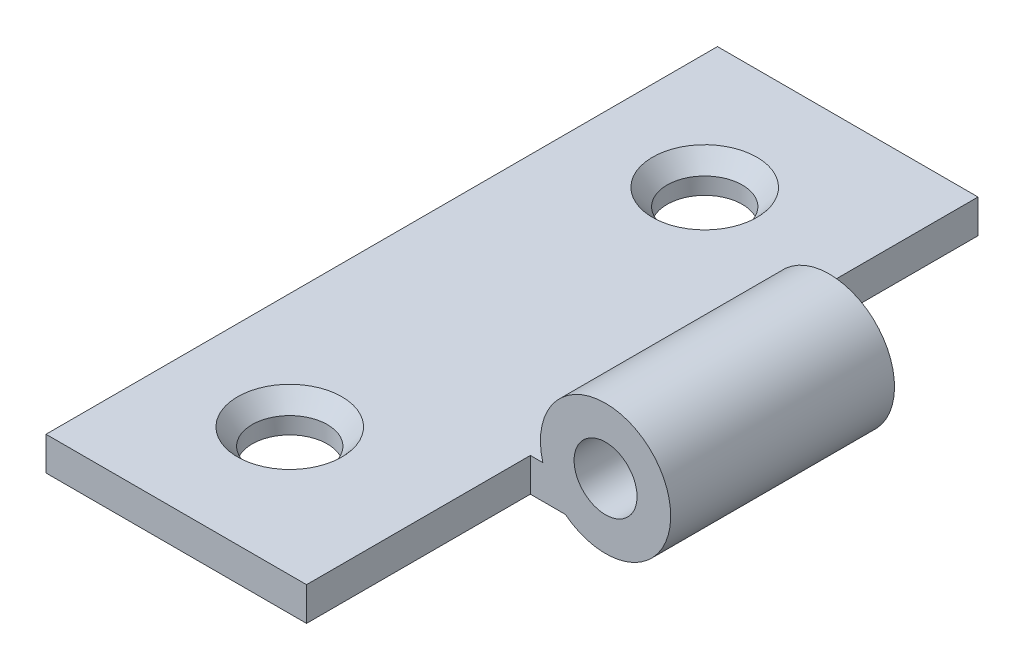
ISO-10303-21;
HEADER;
FILE_DESCRIPTION(('STEP AP214'),'2;1');
FILE_NAME('part.step','',(''),(''),'','','');
FILE_SCHEMA(('AUTOMOTIVE_DESIGN { 1 0 10303 214 1 1 1 1 }'));
ENDSEC;
DATA;
#1=APPLICATION_CONTEXT('core data for automotive mechanical design processes');
#2=APPLICATION_PROTOCOL_DEFINITION('international standard','automotive_design',2000,#1);
#3=PRODUCT_CONTEXT('',#1,'mechanical');
#4=PRODUCT('Part','Part','',(#3));
#5=PRODUCT_RELATED_PRODUCT_CATEGORY('part','',(#4));
#6=PRODUCT_DEFINITION_FORMATION('','',#4);
#7=PRODUCT_DEFINITION_CONTEXT('part definition',#1,'design');
#8=PRODUCT_DEFINITION('design','',#6,#7);
#9=PRODUCT_DEFINITION_SHAPE('','',#8);
#10=(LENGTH_UNIT() NAMED_UNIT(*) SI_UNIT(.MILLI.,.METRE.));
#11=(NAMED_UNIT(*) PLANE_ANGLE_UNIT() SI_UNIT($,.RADIAN.));
#12=(NAMED_UNIT(*) SI_UNIT($,.STERADIAN.) SOLID_ANGLE_UNIT());
#13=UNCERTAINTY_MEASURE_WITH_UNIT(LENGTH_MEASURE(1.E-05),#10,'distance_accuracy_value','');
#14=(GEOMETRIC_REPRESENTATION_CONTEXT(3) GLOBAL_UNCERTAINTY_ASSIGNED_CONTEXT((#13)) GLOBAL_UNIT_ASSIGNED_CONTEXT((#10,
#11,#12)) REPRESENTATION_CONTEXT('',''));
#15=CARTESIAN_POINT('',(0.,0.,0.));
#16=DIRECTION('',(0.,0.,1.));
#17=DIRECTION('',(1.,0.,0.));
#18=AXIS2_PLACEMENT_3D('',#15,#16,#17);
#19=CARTESIAN_POINT('',(-2.8448,-0.668813619744906,12.7));
#20=DIRECTION('',(-1.,0.,0.));
#21=DIRECTION('',(0.,0.,1.));
#22=AXIS2_PLACEMENT_3D('',#19,#20,#21);
#23=PLANE('',#22);
#24=DIRECTION('',(0.,-1.,0.));
#25=VECTOR('',#24,1.);
#26=CARTESIAN_POINT('',(-2.8448,-0.668813619744906,4.23333333333333));
#27=LINE('',#26,#25);
#28=CARTESIAN_POINT('',(-2.8448,-0.668813619744906,4.23333333333333));
#29=VERTEX_POINT('',#28);
#30=CARTESIAN_POINT('',(-2.8448,-1.93881361974491,4.23333333333333));
#31=VERTEX_POINT('',#30);
#32=EDGE_CURVE('E131',#29,#31,#27,.T.);
#33=ORIENTED_EDGE('',*,*,#32,.F.);
#34=DIRECTION('',(0.,0.,-1.));
#35=VECTOR('',#34,1.);
#36=CARTESIAN_POINT('',(-2.8448,-0.668813619744906,12.7));
#37=LINE('',#36,#35);
#38=CARTESIAN_POINT('',(-2.8448,-0.668813619744906,12.7));
#39=VERTEX_POINT('',#38);
#40=EDGE_CURVE('E169',#39,#29,#37,.T.);
#41=ORIENTED_EDGE('',*,*,#40,.F.);
#42=DIRECTION('',(0.,1.,0.));
#43=VECTOR('',#42,1.);
#44=CARTESIAN_POINT('',(-2.8448,-0.668813619744906,12.7));
#45=LINE('',#44,#43);
#46=CARTESIAN_POINT('',(-2.8448,-1.93881361974491,12.7));
#47=VERTEX_POINT('',#46);
#48=EDGE_CURVE('E253',#47,#39,#45,.T.);
#49=ORIENTED_EDGE('',*,*,#48,.F.);
#50=DIRECTION('',(0.,0.,-1.));
#51=VECTOR('',#50,1.);
#52=CARTESIAN_POINT('',(-2.8448,-1.93881361974491,12.7));
#53=LINE('',#52,#51);
#54=EDGE_CURVE('E178',#47,#31,#53,.T.);
#55=ORIENTED_EDGE('',*,*,#54,.T.);
#56=EDGE_LOOP('',(#33,#41,#49,#55));
#57=FACE_BOUND('',#56,.T.);
#58=ADVANCED_FACE('F34',(#57),#23,.F.);
#59=CARTESIAN_POINT('',(-12.7,-0.668813619744906,12.7));
#60=DIRECTION('',(1.,0.,0.));
#61=DIRECTION('',(0.,0.,-1.));
#62=AXIS2_PLACEMENT_3D('',#59,#60,#61);
#63=PLANE('',#62);
#64=DIRECTION('',(0.,-1.,0.));
#65=VECTOR('',#64,1.);
#66=CARTESIAN_POINT('',(-12.7,-0.668813619744906,-12.7));
#67=LINE('',#66,#65);
#68=CARTESIAN_POINT('',(-12.7,-0.668813619744906,-12.7));
#69=VERTEX_POINT('',#68);
#70=CARTESIAN_POINT('',(-12.7,-1.93881361974491,-12.7));
#71=VERTEX_POINT('',#70);
#72=EDGE_CURVE('E244',#69,#71,#67,.T.);
#73=ORIENTED_EDGE('',*,*,#72,.T.);
#74=DIRECTION('',(0.,0.,-1.));
#75=VECTOR('',#74,1.);
#76=CARTESIAN_POINT('',(-12.7,-1.93881361974491,12.7));
#77=LINE('',#76,#75);
#78=CARTESIAN_POINT('',(-12.7,-1.93881361974491,12.7));
#79=VERTEX_POINT('',#78);
#80=EDGE_CURVE('E186',#79,#71,#77,.T.);
#81=ORIENTED_EDGE('',*,*,#80,.F.);
#82=DIRECTION('',(0.,-1.,0.));
#83=VECTOR('',#82,1.);
#84=CARTESIAN_POINT('',(-12.7,-0.668813619744906,12.7));
#85=LINE('',#84,#83);
#86=CARTESIAN_POINT('',(-12.7,-0.668813619744906,12.7));
#87=VERTEX_POINT('',#86);
#88=EDGE_CURVE('E250',#87,#79,#85,.T.);
#89=ORIENTED_EDGE('',*,*,#88,.F.);
#90=DIRECTION('',(0.,0.,-1.));
#91=VECTOR('',#90,1.);
#92=CARTESIAN_POINT('',(-12.7,-0.668813619744906,12.7));
#93=LINE('',#92,#91);
#94=EDGE_CURVE('E170',#87,#69,#93,.T.);
#95=ORIENTED_EDGE('',*,*,#94,.T.);
#96=EDGE_LOOP('',(#73,#81,#89,#95));
#97=FACE_BOUND('',#96,.T.);
#98=ADVANCED_FACE('F219',(#97),#63,.F.);
#99=CARTESIAN_POINT('',(-12.7,-1.93881361974491,12.7));
#100=DIRECTION('',(0.,1.,0.));
#101=DIRECTION('',(0.,0.,1.));
#102=AXIS2_PLACEMENT_3D('',#99,#100,#101);
#103=PLANE('',#102);
#104=CARTESIAN_POINT('',(-8.3312,-1.93881361974491,7.8486));
#105=DIRECTION('',(0.,1.,0.));
#106=DIRECTION('',(0.,0.,1.));
#107=AXIS2_PLACEMENT_3D('',#104,#105,#106);
#108=CIRCLE('',#107,1.4224);
#109=CARTESIAN_POINT('',(-8.3312,-1.93881361974491,9.271));
#110=VERTEX_POINT('',#109);
#111=EDGE_CURVE('E239',#110,#110,#108,.T.);
#112=ORIENTED_EDGE('',*,*,#111,.T.);
#113=EDGE_LOOP('',(#112));
#114=FACE_BOUND('',#113,.T.);
#115=CARTESIAN_POINT('',(-8.3312,-1.93881361974491,-7.8486));
#116=DIRECTION('',(0.,1.,0.));
#117=DIRECTION('',(0.,0.,1.));
#118=AXIS2_PLACEMENT_3D('',#115,#116,#117);
#119=CIRCLE('',#118,1.4224);
#120=CARTESIAN_POINT('',(-8.3312,-1.93881361974491,-6.4262));
#121=VERTEX_POINT('',#120);
#122=EDGE_CURVE('E242',#121,#121,#119,.T.);
#123=ORIENTED_EDGE('',*,*,#122,.T.);
#124=EDGE_LOOP('',(#123));
#125=FACE_BOUND('',#124,.T.);
#126=DIRECTION('',(1.,0.,0.));
#127=VECTOR('',#126,1.);
#128=CARTESIAN_POINT('',(-12.7,-1.93881361974491,-12.7));
#129=LINE('',#128,#127);
#130=CARTESIAN_POINT('',(-2.8448,-1.93881361974491,-12.7));
#131=VERTEX_POINT('',#130);
#132=EDGE_CURVE('E246',#71,#131,#129,.T.);
#133=ORIENTED_EDGE('',*,*,#132,.T.);
#134=CARTESIAN_POINT('',(-2.8448,-1.93881361974491,-4.23333333333334));
#135=VERTEX_POINT('',#134);
#136=EDGE_CURVE('E173',#135,#131,#53,.T.);
#137=ORIENTED_EDGE('',*,*,#136,.F.);
#138=DIRECTION('',(1.,0.,0.));
#139=VECTOR('',#138,1.);
#140=CARTESIAN_POINT('',(-2.8448,-1.93881361974491,-4.23333333333333));
#141=LINE('',#140,#139);
#142=CARTESIAN_POINT('',(-1.52030003219485,-1.93881361974491,-4.23333333333333));
#143=VERTEX_POINT('',#142);
#144=EDGE_CURVE('E51',#135,#143,#141,.T.);
#145=ORIENTED_EDGE('',*,*,#144,.T.);
#146=DIRECTION('',(0.,0.,-1.));
#147=VECTOR('',#146,1.);
#148=CARTESIAN_POINT('',(-1.52030003219485,-1.93881361974491,11.4764318222399));
#149=LINE('',#148,#147);
#150=CARTESIAN_POINT('',(-1.52030003219485,-1.93881361974491,4.23333333333333));
#151=VERTEX_POINT('',#150);
#152=EDGE_CURVE('E109',#151,#143,#149,.T.);
#153=ORIENTED_EDGE('',*,*,#152,.F.);
#154=DIRECTION('',(1.,0.,0.));
#155=VECTOR('',#154,1.);
#156=CARTESIAN_POINT('',(-2.8448,-1.93881361974491,4.23333333333333));
#157=LINE('',#156,#155);
#158=EDGE_CURVE('E114',#31,#151,#157,.T.);
#159=ORIENTED_EDGE('',*,*,#158,.F.);
#160=ORIENTED_EDGE('',*,*,#54,.F.);
#161=DIRECTION('',(1.,0.,0.));
#162=VECTOR('',#161,1.);
#163=CARTESIAN_POINT('',(-12.7,-1.93881361974491,12.7));
#164=LINE('',#163,#162);
#165=EDGE_CURVE('E88',#79,#47,#164,.T.);
#166=ORIENTED_EDGE('',*,*,#165,.F.);
#167=ORIENTED_EDGE('',*,*,#80,.T.);
#168=EDGE_LOOP('',(#133,#137,#145,#153,#159,#160,#166,#167));
#169=FACE_BOUND('',#168,.T.);
#170=ADVANCED_FACE('F112',(#114,#125,#169),#103,.F.);
#171=CARTESIAN_POINT('',(-2.8448,-0.668813619744906,-4.23333333333333));
#172=VERTEX_POINT('',#171);
#173=CARTESIAN_POINT('',(-2.8448,-0.668813619744906,-12.7));
#174=VERTEX_POINT('',#173);
#175=EDGE_CURVE('E161',#172,#174,#37,.T.);
#176=ORIENTED_EDGE('',*,*,#175,.F.);
#177=DIRECTION('',(0.,-1.,0.));
#178=VECTOR('',#177,1.);
#179=CARTESIAN_POINT('',(-2.8448,-0.668813619744906,-4.23333333333333));
#180=LINE('',#179,#178);
#181=EDGE_CURVE('E154',#172,#135,#180,.T.);
#182=ORIENTED_EDGE('',*,*,#181,.T.);
#183=ORIENTED_EDGE('',*,*,#136,.T.);
#184=DIRECTION('',(0.,1.,0.));
#185=VECTOR('',#184,1.);
#186=CARTESIAN_POINT('',(-2.8448,-0.668813619744906,-12.7));
#187=LINE('',#186,#185);
#188=EDGE_CURVE('E168',#131,#174,#187,.T.);
#189=ORIENTED_EDGE('',*,*,#188,.T.);
#190=EDGE_LOOP('',(#176,#182,#183,#189));
#191=FACE_BOUND('',#190,.T.);
#192=ADVANCED_FACE('F166',(#191),#23,.F.);
#193=CARTESIAN_POINT('',(-12.7,-0.668813619744906,12.7));
#194=DIRECTION('',(0.,-1.,0.));
#195=DIRECTION('',(0.,0.,-1.));
#196=AXIS2_PLACEMENT_3D('',#193,#194,#195);
#197=PLANE('',#196);
#198=CARTESIAN_POINT('',(-8.3312,-0.668813619744906,7.8486));
#199=DIRECTION('',(0.,-1.,0.));
#200=DIRECTION('',(0.,0.,-1.));
#201=AXIS2_PLACEMENT_3D('',#198,#199,#200);
#202=CIRCLE('',#201,1.9743970785133);
#203=CARTESIAN_POINT('',(-8.3312,-0.668813619744906,5.8742029214867));
#204=VERTEX_POINT('',#203);
#205=EDGE_CURVE('E43',#204,#204,#202,.T.);
#206=ORIENTED_EDGE('',*,*,#205,.T.);
#207=EDGE_LOOP('',(#206));
#208=FACE_BOUND('',#207,.T.);
#209=CARTESIAN_POINT('',(-8.3312,-0.668813619744906,-7.8486));
#210=DIRECTION('',(0.,-1.,0.));
#211=DIRECTION('',(0.,0.,-1.));
#212=AXIS2_PLACEMENT_3D('',#209,#210,#211);
#213=CIRCLE('',#212,1.9743970785133);
#214=CARTESIAN_POINT('',(-8.3312,-0.668813619744906,-9.8229970785133));
#215=VERTEX_POINT('',#214);
#216=EDGE_CURVE('E195',#215,#215,#213,.T.);
#217=ORIENTED_EDGE('',*,*,#216,.T.);
#218=EDGE_LOOP('',(#217));
#219=FACE_BOUND('',#218,.T.);
#220=DIRECTION('',(-1.,0.,0.));
#221=VECTOR('',#220,1.);
#222=CARTESIAN_POINT('',(-12.7,-0.668813619744906,-12.7));
#223=LINE('',#222,#221);
#224=EDGE_CURVE('E80',#174,#69,#223,.T.);
#225=ORIENTED_EDGE('',*,*,#224,.T.);
#226=ORIENTED_EDGE('',*,*,#94,.F.);
#227=DIRECTION('',(-1.,0.,0.));
#228=VECTOR('',#227,1.);
#229=CARTESIAN_POINT('',(-12.7,-0.668813619744906,12.7));
#230=LINE('',#229,#228);
#231=EDGE_CURVE('E60',#39,#87,#230,.T.);
#232=ORIENTED_EDGE('',*,*,#231,.F.);
#233=ORIENTED_EDGE('',*,*,#40,.T.);
#234=DIRECTION('',(-1.,0.,0.));
#235=VECTOR('',#234,1.);
#236=CARTESIAN_POINT('',(-2.37128631380601,-0.668813619744906,4.23333333333333));
#237=LINE('',#236,#235);
#238=CARTESIAN_POINT('',(-2.37128631380601,-0.668813619744906,4.23333333333333));
#239=VERTEX_POINT('',#238);
#240=EDGE_CURVE('E127',#239,#29,#237,.T.);
#241=ORIENTED_EDGE('',*,*,#240,.F.);
#242=DIRECTION('',(0.,0.,-1.));
#243=VECTOR('',#242,1.);
#244=CARTESIAN_POINT('',(-2.37128631380601,-0.668813619744906,11.4764318222399));
#245=LINE('',#244,#243);
#246=CARTESIAN_POINT('',(-2.37128631380601,-0.668813619744906,-4.23333333333333));
#247=VERTEX_POINT('',#246);
#248=EDGE_CURVE('E119',#239,#247,#245,.T.);
#249=ORIENTED_EDGE('',*,*,#248,.T.);
#250=DIRECTION('',(-1.,0.,0.));
#251=VECTOR('',#250,1.);
#252=CARTESIAN_POINT('',(-2.37128631380601,-0.668813619744906,-4.23333333333333));
#253=LINE('',#252,#251);
#254=EDGE_CURVE('E150',#247,#172,#253,.T.);
#255=ORIENTED_EDGE('',*,*,#254,.T.);
#256=ORIENTED_EDGE('',*,*,#175,.T.);
#257=EDGE_LOOP('',(#225,#226,#232,#233,#241,#249,#255,#256));
#258=FACE_BOUND('',#257,.T.);
#259=ADVANCED_FACE('F159',(#208,#219,#258),#197,.F.);
#260=CARTESIAN_POINT('',(-12.7,-1.93881361974491,12.7));
#261=DIRECTION('',(0.,0.,1.));
#262=DIRECTION('',(1.,0.,0.));
#263=AXIS2_PLACEMENT_3D('',#260,#261,#262);
#264=PLANE('',#263);
#265=ORIENTED_EDGE('',*,*,#88,.T.);
#266=ORIENTED_EDGE('',*,*,#165,.T.);
#267=ORIENTED_EDGE('',*,*,#48,.T.);
#268=ORIENTED_EDGE('',*,*,#231,.T.);
#269=EDGE_LOOP('',(#265,#266,#267,#268));
#270=FACE_BOUND('',#269,.T.);
#271=ADVANCED_FACE('F232',(#270),#264,.T.);
#272=CARTESIAN_POINT('',(-12.7,-1.93881361974491,-12.7));
#273=DIRECTION('',(0.,0.,1.));
#274=DIRECTION('',(1.,0.,0.));
#275=AXIS2_PLACEMENT_3D('',#272,#273,#274);
#276=PLANE('',#275);
#277=ORIENTED_EDGE('',*,*,#72,.F.);
#278=ORIENTED_EDGE('',*,*,#224,.F.);
#279=ORIENTED_EDGE('',*,*,#188,.F.);
#280=ORIENTED_EDGE('',*,*,#132,.F.);
#281=EDGE_LOOP('',(#277,#278,#279,#280));
#282=FACE_BOUND('',#281,.T.);
#283=ADVANCED_FACE('F259',(#282),#276,.F.);
#284=CARTESIAN_POINT('',(-8.3312,-2.46380000000001,-7.8486));
#285=DIRECTION('',(0.,1.,0.));
#286=DIRECTION('',(0.,0.,1.));
#287=AXIS2_PLACEMENT_3D('',#284,#285,#286);
#288=CYLINDRICAL_SURFACE('',#287,1.4224);
#289=CARTESIAN_POINT('',(-8.3312,-1.3038136197449,-7.8486));
#290=DIRECTION('',(0.,-1.,0.));
#291=DIRECTION('',(0.,0.,-1.));
#292=AXIS2_PLACEMENT_3D('',#289,#290,#291);
#293=CIRCLE('',#292,1.4224);
#294=CARTESIAN_POINT('',(-8.3312,-1.3038136197449,-9.271));
#295=VERTEX_POINT('',#294);
#296=EDGE_CURVE('E11',#295,#295,#293,.F.);
#297=ORIENTED_EDGE('',*,*,#296,.T.);
#298=EDGE_LOOP('',(#297));
#299=FACE_BOUND('',#298,.T.);
#300=ORIENTED_EDGE('',*,*,#122,.F.);
#301=EDGE_LOOP('',(#300));
#302=FACE_BOUND('',#301,.T.);
#303=ADVANCED_FACE('F215',(#299,#302),#288,.F.);
#304=CARTESIAN_POINT('',(-8.3312,-2.46380000000001,7.8486));
#305=DIRECTION('',(0.,1.,0.));
#306=DIRECTION('',(0.,0.,1.));
#307=AXIS2_PLACEMENT_3D('',#304,#305,#306);
#308=CYLINDRICAL_SURFACE('',#307,1.4224);
#309=CARTESIAN_POINT('',(-8.3312,-1.30381361974491,7.8486));
#310=DIRECTION('',(0.,-1.,0.));
#311=DIRECTION('',(0.,0.,-1.));
#312=AXIS2_PLACEMENT_3D('',#309,#310,#311);
#313=CIRCLE('',#312,1.4224);
#314=CARTESIAN_POINT('',(-8.3312,-1.30381361974491,6.4262));
#315=VERTEX_POINT('',#314);
#316=EDGE_CURVE('E191',#315,#315,#313,.F.);
#317=ORIENTED_EDGE('',*,*,#316,.T.);
#318=EDGE_LOOP('',(#317));
#319=FACE_BOUND('',#318,.T.);
#320=ORIENTED_EDGE('',*,*,#111,.F.);
#321=EDGE_LOOP('',(#320));
#322=FACE_BOUND('',#321,.T.);
#323=ADVANCED_FACE('F209',(#319,#322),#308,.F.);
#324=CARTESIAN_POINT('',(-8.3312,-1.30381361974491,7.8486));
#325=DIRECTION('',(0.,1.,0.));
#326=DIRECTION('',(0.,0.,1.));
#327=AXIS2_PLACEMENT_3D('',#324,#325,#326);
#328=CONICAL_SURFACE('',#327,1.4224,0.715584993317671);
#329=ORIENTED_EDGE('',*,*,#205,.F.);
#330=EDGE_LOOP('',(#329));
#331=FACE_BOUND('',#330,.T.);
#332=ORIENTED_EDGE('',*,*,#316,.F.);
#333=EDGE_LOOP('',(#332));
#334=FACE_BOUND('',#333,.T.);
#335=ADVANCED_FACE('F206',(#331,#334),#328,.F.);
#336=CARTESIAN_POINT('',(-8.3312,-1.3038136197449,-7.8486));
#337=DIRECTION('',(0.,1.,0.));
#338=DIRECTION('',(0.,0.,1.));
#339=AXIS2_PLACEMENT_3D('',#336,#337,#338);
#340=CONICAL_SURFACE('',#339,1.4224,0.715584993317672);
#341=ORIENTED_EDGE('',*,*,#216,.F.);
#342=EDGE_LOOP('',(#341));
#343=FACE_BOUND('',#342,.T.);
#344=ORIENTED_EDGE('',*,*,#296,.F.);
#345=EDGE_LOOP('',(#344));
#346=FACE_BOUND('',#345,.T.);
#347=ADVANCED_FACE('F36',(#343,#346),#340,.F.);
#348=CARTESIAN_POINT('',(0.,0.,11.4764318222399));
#349=DIRECTION('',(0.,0.,-1.));
#350=DIRECTION('',(-1.,0.,0.));
#351=AXIS2_PLACEMENT_3D('',#348,#349,#350);
#352=CYLINDRICAL_SURFACE('',#351,2.4638);
#353=CARTESIAN_POINT('',(0.,0.,4.23333333333333));
#354=DIRECTION('',(0.,0.,1.));
#355=DIRECTION('',(1.,0.,0.));
#356=AXIS2_PLACEMENT_3D('',#353,#354,#355);
#357=CIRCLE('',#356,2.4638);
#358=EDGE_CURVE('E123',#151,#239,#357,.T.);
#359=ORIENTED_EDGE('',*,*,#358,.F.);
#360=ORIENTED_EDGE('',*,*,#152,.T.);
#361=CARTESIAN_POINT('',(0.,0.,-4.23333333333333));
#362=DIRECTION('',(0.,0.,1.));
#363=DIRECTION('',(1.,0.,0.));
#364=AXIS2_PLACEMENT_3D('',#361,#362,#363);
#365=CIRCLE('',#364,2.4638);
#366=EDGE_CURVE('E148',#143,#247,#365,.T.);
#367=ORIENTED_EDGE('',*,*,#366,.T.);
#368=ORIENTED_EDGE('',*,*,#248,.F.);
#369=EDGE_LOOP('',(#359,#360,#367,#368));
#370=FACE_BOUND('',#369,.T.);
#371=ADVANCED_FACE('F124',(#370),#352,.T.);
#372=CARTESIAN_POINT('',(0.,0.,-4.23333333333333));
#373=DIRECTION('',(0.,0.,1.));
#374=DIRECTION('',(1.,0.,0.));
#375=AXIS2_PLACEMENT_3D('',#372,#373,#374);
#376=PLANE('',#375);
#377=ORIENTED_EDGE('',*,*,#366,.F.);
#378=ORIENTED_EDGE('',*,*,#144,.F.);
#379=ORIENTED_EDGE('',*,*,#181,.F.);
#380=ORIENTED_EDGE('',*,*,#254,.F.);
#381=EDGE_LOOP('',(#377,#378,#379,#380));
#382=FACE_BOUND('',#381,.T.);
#383=CARTESIAN_POINT('',(0.,0.,-4.23333333333333));
#384=DIRECTION('',(0.,0.,1.));
#385=DIRECTION('',(1.,0.,0.));
#386=AXIS2_PLACEMENT_3D('',#383,#384,#385);
#387=CIRCLE('',#386,1.190625);
#388=CARTESIAN_POINT('',(1.190625,0.,-4.23333333333333));
#389=VERTEX_POINT('',#388);
#390=EDGE_CURVE('E126',#389,#389,#387,.T.);
#391=ORIENTED_EDGE('',*,*,#390,.T.);
#392=EDGE_LOOP('',(#391));
#393=FACE_BOUND('',#392,.T.);
#394=ADVANCED_FACE('F163',(#382,#393),#376,.F.);
#395=CARTESIAN_POINT('',(0.,0.,11.4764318222399));
#396=DIRECTION('',(0.,0.,-1.));
#397=DIRECTION('',(-1.,0.,0.));
#398=AXIS2_PLACEMENT_3D('',#395,#396,#397);
#399=CYLINDRICAL_SURFACE('',#398,1.190625);
#400=ORIENTED_EDGE('',*,*,#390,.F.);
#401=EDGE_LOOP('',(#400));
#402=FACE_BOUND('',#401,.T.);
#403=CARTESIAN_POINT('',(0.,0.,4.23333333333333));
#404=DIRECTION('',(0.,0.,1.));
#405=DIRECTION('',(1.,0.,0.));
#406=AXIS2_PLACEMENT_3D('',#403,#404,#405);
#407=CIRCLE('',#406,1.190625);
#408=CARTESIAN_POINT('',(1.190625,0.,4.23333333333333));
#409=VERTEX_POINT('',#408);
#410=EDGE_CURVE('E133',#409,#409,#407,.T.);
#411=ORIENTED_EDGE('',*,*,#410,.T.);
#412=EDGE_LOOP('',(#411));
#413=FACE_BOUND('',#412,.T.);
#414=ADVANCED_FACE('F276',(#402,#413),#399,.F.);
#415=CARTESIAN_POINT('',(-2.8448,-2.46380000000001,4.23333333333333));
#416=DIRECTION('',(0.,0.,1.));
#417=DIRECTION('',(1.,0.,0.));
#418=AXIS2_PLACEMENT_3D('',#415,#416,#417);
#419=PLANE('',#418);
#420=ORIENTED_EDGE('',*,*,#410,.F.);
#421=EDGE_LOOP('',(#420));
#422=FACE_BOUND('',#421,.T.);
#423=ORIENTED_EDGE('',*,*,#158,.T.);
#424=ORIENTED_EDGE('',*,*,#358,.T.);
#425=ORIENTED_EDGE('',*,*,#240,.T.);
#426=ORIENTED_EDGE('',*,*,#32,.T.);
#427=EDGE_LOOP('',(#423,#424,#425,#426));
#428=FACE_BOUND('',#427,.T.);
#429=ADVANCED_FACE('F129',(#422,#428),#419,.T.);
#430=CLOSED_SHELL('',(#58,#98,#170,#192,#259,#271,#283,#303,#323,#335,#347,#371,#394,#414,#429));
#431=MANIFOLD_SOLID_BREP('B2',#430);
#432=ADVANCED_BREP_SHAPE_REPRESENTATION('',(#18,#431),#14);
#433=SHAPE_DEFINITION_REPRESENTATION(#9,#432);
ENDSEC;
END-ISO-10303-21;
